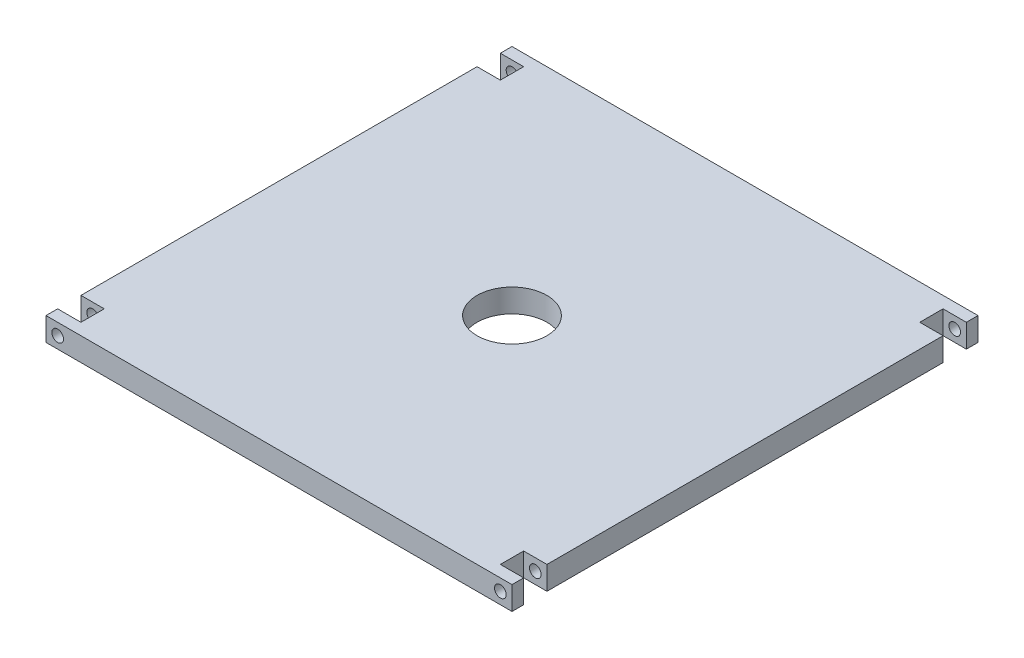
ISO-10303-21;
HEADER;
FILE_DESCRIPTION(('STEP AP214'),'2;1');
FILE_NAME('part.step','',(''),(''),'','','');
FILE_SCHEMA(('AUTOMOTIVE_DESIGN { 1 0 10303 214 1 1 1 1 }'));
ENDSEC;
DATA;
#1=APPLICATION_CONTEXT('core data for automotive mechanical design processes');
#2=APPLICATION_PROTOCOL_DEFINITION('international standard','automotive_design',2000,#1);
#3=PRODUCT_CONTEXT('',#1,'mechanical');
#4=PRODUCT('Part','Part','',(#3));
#5=PRODUCT_RELATED_PRODUCT_CATEGORY('part','',(#4));
#6=PRODUCT_DEFINITION_FORMATION('','',#4);
#7=PRODUCT_DEFINITION_CONTEXT('part definition',#1,'design');
#8=PRODUCT_DEFINITION('design','',#6,#7);
#9=PRODUCT_DEFINITION_SHAPE('','',#8);
#10=(LENGTH_UNIT() NAMED_UNIT(*) SI_UNIT(.MILLI.,.METRE.));
#11=(NAMED_UNIT(*) PLANE_ANGLE_UNIT() SI_UNIT($,.RADIAN.));
#12=(NAMED_UNIT(*) SI_UNIT($,.STERADIAN.) SOLID_ANGLE_UNIT());
#13=UNCERTAINTY_MEASURE_WITH_UNIT(LENGTH_MEASURE(1.E-05),#10,'distance_accuracy_value','');
#14=(GEOMETRIC_REPRESENTATION_CONTEXT(3) GLOBAL_UNCERTAINTY_ASSIGNED_CONTEXT((#13)) GLOBAL_UNIT_ASSIGNED_CONTEXT((#10,
#11,#12)) REPRESENTATION_CONTEXT('',''));
#15=CARTESIAN_POINT('',(0.,0.,0.));
#16=DIRECTION('',(0.,0.,1.));
#17=DIRECTION('',(1.,0.,0.));
#18=AXIS2_PLACEMENT_3D('',#15,#16,#17);
#19=CARTESIAN_POINT('',(0.,10.,0.));
#20=DIRECTION('',(0.,1.,0.));
#21=DIRECTION('',(0.,0.,1.));
#22=AXIS2_PLACEMENT_3D('',#19,#20,#21);
#23=PLANE('',#22);
#24=DIRECTION('',(1.,0.,0.));
#25=VECTOR('',#24,1.);
#26=CARTESIAN_POINT('',(-15.,10.,100.));
#27=LINE('',#26,#25);
#28=CARTESIAN_POINT('',(-100.,10.,100.));
#29=VERTEX_POINT('',#28);
#30=CARTESIAN_POINT('',(100.,10.,100.));
#31=VERTEX_POINT('',#30);
#32=EDGE_CURVE('E129',#29,#31,#27,.T.);
#33=ORIENTED_EDGE('',*,*,#32,.T.);
#34=DIRECTION('',(0.,0.,-1.));
#35=VECTOR('',#34,1.);
#36=CARTESIAN_POINT('',(100.,10.,95.));
#37=LINE('',#36,#35);
#38=CARTESIAN_POINT('',(100.,10.,95.));
#39=VERTEX_POINT('',#38);
#40=EDGE_CURVE('E351',#31,#39,#37,.T.);
#41=ORIENTED_EDGE('',*,*,#40,.T.);
#42=DIRECTION('',(-1.,0.,0.));
#43=VECTOR('',#42,1.);
#44=CARTESIAN_POINT('',(100.,10.,95.));
#45=LINE('',#44,#43);
#46=CARTESIAN_POINT('',(90.,10.,95.));
#47=VERTEX_POINT('',#46);
#48=EDGE_CURVE('E294',#39,#47,#45,.T.);
#49=ORIENTED_EDGE('',*,*,#48,.T.);
#50=DIRECTION('',(0.,0.,-1.));
#51=VECTOR('',#50,1.);
#52=CARTESIAN_POINT('',(90.,10.,95.));
#53=LINE('',#52,#51);
#54=CARTESIAN_POINT('',(90.,10.,85.));
#55=VERTEX_POINT('',#54);
#56=EDGE_CURVE('E313',#47,#55,#53,.T.);
#57=ORIENTED_EDGE('',*,*,#56,.T.);
#58=DIRECTION('',(1.,0.,0.));
#59=VECTOR('',#58,1.);
#60=CARTESIAN_POINT('',(90.,10.,85.));
#61=LINE('',#60,#59);
#62=CARTESIAN_POINT('',(100.,10.,85.));
#63=VERTEX_POINT('',#62);
#64=EDGE_CURVE('E310',#55,#63,#61,.T.);
#65=ORIENTED_EDGE('',*,*,#64,.T.);
#66=DIRECTION('',(0.,0.,-1.));
#67=VECTOR('',#66,1.);
#68=CARTESIAN_POINT('',(100.,10.,-85.));
#69=LINE('',#68,#67);
#70=CARTESIAN_POINT('',(100.,10.,-85.));
#71=VERTEX_POINT('',#70);
#72=EDGE_CURVE('E312',#63,#71,#69,.T.);
#73=ORIENTED_EDGE('',*,*,#72,.T.);
#74=DIRECTION('',(-1.,0.,0.));
#75=VECTOR('',#74,1.);
#76=CARTESIAN_POINT('',(90.,10.,-85.));
#77=LINE('',#76,#75);
#78=CARTESIAN_POINT('',(90.,10.,-85.));
#79=VERTEX_POINT('',#78);
#80=EDGE_CURVE('E315',#71,#79,#77,.T.);
#81=ORIENTED_EDGE('',*,*,#80,.T.);
#82=DIRECTION('',(0.,0.,-1.));
#83=VECTOR('',#82,1.);
#84=CARTESIAN_POINT('',(90.,10.,-95.));
#85=LINE('',#84,#83);
#86=CARTESIAN_POINT('',(90.,10.,-95.));
#87=VERTEX_POINT('',#86);
#88=EDGE_CURVE('E321',#79,#87,#85,.T.);
#89=ORIENTED_EDGE('',*,*,#88,.T.);
#90=DIRECTION('',(1.,0.,0.));
#91=VECTOR('',#90,1.);
#92=CARTESIAN_POINT('',(100.,10.,-95.));
#93=LINE('',#92,#91);
#94=CARTESIAN_POINT('',(100.,10.,-95.));
#95=VERTEX_POINT('',#94);
#96=EDGE_CURVE('E323',#87,#95,#93,.T.);
#97=ORIENTED_EDGE('',*,*,#96,.T.);
#98=DIRECTION('',(0.,0.,-1.));
#99=VECTOR('',#98,1.);
#100=CARTESIAN_POINT('',(100.,10.,-100.));
#101=LINE('',#100,#99);
#102=CARTESIAN_POINT('',(100.,10.,-100.));
#103=VERTEX_POINT('',#102);
#104=EDGE_CURVE('E325',#95,#103,#101,.T.);
#105=ORIENTED_EDGE('',*,*,#104,.T.);
#106=DIRECTION('',(-1.,0.,0.));
#107=VECTOR('',#106,1.);
#108=CARTESIAN_POINT('',(100.,10.,-100.));
#109=LINE('',#108,#107);
#110=CARTESIAN_POINT('',(-100.,10.,-100.));
#111=VERTEX_POINT('',#110);
#112=EDGE_CURVE('E327',#103,#111,#109,.T.);
#113=ORIENTED_EDGE('',*,*,#112,.T.);
#114=DIRECTION('',(0.,0.,1.));
#115=VECTOR('',#114,1.);
#116=CARTESIAN_POINT('',(-100.,10.,-100.));
#117=LINE('',#116,#115);
#118=CARTESIAN_POINT('',(-100.,10.,-95.));
#119=VERTEX_POINT('',#118);
#120=EDGE_CURVE('E329',#111,#119,#117,.T.);
#121=ORIENTED_EDGE('',*,*,#120,.T.);
#122=DIRECTION('',(1.,0.,0.));
#123=VECTOR('',#122,1.);
#124=CARTESIAN_POINT('',(-100.,10.,-95.));
#125=LINE('',#124,#123);
#126=CARTESIAN_POINT('',(-90.,10.,-95.));
#127=VERTEX_POINT('',#126);
#128=EDGE_CURVE('E331',#119,#127,#125,.T.);
#129=ORIENTED_EDGE('',*,*,#128,.T.);
#130=DIRECTION('',(0.,0.,1.));
#131=VECTOR('',#130,1.);
#132=CARTESIAN_POINT('',(-90.,10.,-95.));
#133=LINE('',#132,#131);
#134=CARTESIAN_POINT('',(-90.,10.,-85.));
#135=VERTEX_POINT('',#134);
#136=EDGE_CURVE('E333',#127,#135,#133,.T.);
#137=ORIENTED_EDGE('',*,*,#136,.T.);
#138=DIRECTION('',(-1.,0.,0.));
#139=VECTOR('',#138,1.);
#140=CARTESIAN_POINT('',(-90.,10.,-85.));
#141=LINE('',#140,#139);
#142=CARTESIAN_POINT('',(-100.,10.,-85.));
#143=VERTEX_POINT('',#142);
#144=EDGE_CURVE('E335',#135,#143,#141,.T.);
#145=ORIENTED_EDGE('',*,*,#144,.T.);
#146=DIRECTION('',(0.,0.,1.));
#147=VECTOR('',#146,1.);
#148=CARTESIAN_POINT('',(-100.,10.,-85.));
#149=LINE('',#148,#147);
#150=CARTESIAN_POINT('',(-100.,10.,85.));
#151=VERTEX_POINT('',#150);
#152=EDGE_CURVE('E337',#143,#151,#149,.T.);
#153=ORIENTED_EDGE('',*,*,#152,.T.);
#154=DIRECTION('',(1.,0.,0.));
#155=VECTOR('',#154,1.);
#156=CARTESIAN_POINT('',(-90.,10.,85.));
#157=LINE('',#156,#155);
#158=CARTESIAN_POINT('',(-90.,10.,85.));
#159=VERTEX_POINT('',#158);
#160=EDGE_CURVE('E185',#151,#159,#157,.T.);
#161=ORIENTED_EDGE('',*,*,#160,.T.);
#162=DIRECTION('',(0.,0.,1.));
#163=VECTOR('',#162,1.);
#164=CARTESIAN_POINT('',(-90.,10.,95.));
#165=LINE('',#164,#163);
#166=CARTESIAN_POINT('',(-90.,10.,95.));
#167=VERTEX_POINT('',#166);
#168=EDGE_CURVE('E179',#159,#167,#165,.T.);
#169=ORIENTED_EDGE('',*,*,#168,.T.);
#170=DIRECTION('',(-1.,0.,0.));
#171=VECTOR('',#170,1.);
#172=CARTESIAN_POINT('',(-100.,10.,95.));
#173=LINE('',#172,#171);
#174=CARTESIAN_POINT('',(-100.,10.,95.));
#175=VERTEX_POINT('',#174);
#176=EDGE_CURVE('E183',#167,#175,#173,.T.);
#177=ORIENTED_EDGE('',*,*,#176,.T.);
#178=DIRECTION('',(0.,0.,1.));
#179=VECTOR('',#178,1.);
#180=CARTESIAN_POINT('',(-100.,10.,95.));
#181=LINE('',#180,#179);
#182=EDGE_CURVE('E51',#175,#29,#181,.T.);
#183=ORIENTED_EDGE('',*,*,#182,.T.);
#184=EDGE_LOOP('',(#33,#41,#49,#57,#65,#73,#81,#89,#97,#105,#113,#121,#129,#137,#145,#153,#161,
#169,#177,#183));
#185=FACE_BOUND('',#184,.T.);
#186=CARTESIAN_POINT('',(0.,10.,0.));
#187=DIRECTION('',(0.,1.,0.));
#188=DIRECTION('',(0.,0.,1.));
#189=AXIS2_PLACEMENT_3D('',#186,#187,#188);
#190=CIRCLE('',#189,15.);
#191=CARTESIAN_POINT('',(0.,10.,15.));
#192=VERTEX_POINT('',#191);
#193=EDGE_CURVE('E205',#192,#192,#190,.T.);
#194=ORIENTED_EDGE('',*,*,#193,.F.);
#195=EDGE_LOOP('',(#194));
#196=FACE_BOUND('',#195,.T.);
#197=ADVANCED_FACE('F33',(#185,#196),#23,.T.);
#198=CARTESIAN_POINT('',(0.,0.,0.));
#199=DIRECTION('',(0.,1.,0.));
#200=DIRECTION('',(0.,0.,1.));
#201=AXIS2_PLACEMENT_3D('',#198,#199,#200);
#202=PLANE('',#201);
#203=DIRECTION('',(1.,0.,0.));
#204=VECTOR('',#203,1.);
#205=CARTESIAN_POINT('',(100.,0.,100.));
#206=LINE('',#205,#204);
#207=CARTESIAN_POINT('',(-100.,0.,100.));
#208=VERTEX_POINT('',#207);
#209=CARTESIAN_POINT('',(100.,0.,100.));
#210=VERTEX_POINT('',#209);
#211=EDGE_CURVE('E123',#208,#210,#206,.T.);
#212=ORIENTED_EDGE('',*,*,#211,.F.);
#213=DIRECTION('',(0.,0.,1.));
#214=VECTOR('',#213,1.);
#215=CARTESIAN_POINT('',(-100.,0.,95.));
#216=LINE('',#215,#214);
#217=CARTESIAN_POINT('',(-100.,0.,95.));
#218=VERTEX_POINT('',#217);
#219=EDGE_CURVE('E239',#218,#208,#216,.T.);
#220=ORIENTED_EDGE('',*,*,#219,.F.);
#221=DIRECTION('',(-1.,0.,0.));
#222=VECTOR('',#221,1.);
#223=CARTESIAN_POINT('',(-100.,0.,95.));
#224=LINE('',#223,#222);
#225=CARTESIAN_POINT('',(-90.,0.,95.));
#226=VERTEX_POINT('',#225);
#227=EDGE_CURVE('E116',#226,#218,#224,.T.);
#228=ORIENTED_EDGE('',*,*,#227,.F.);
#229=DIRECTION('',(0.,0.,1.));
#230=VECTOR('',#229,1.);
#231=CARTESIAN_POINT('',(-90.,0.,95.));
#232=LINE('',#231,#230);
#233=CARTESIAN_POINT('',(-90.,0.,85.));
#234=VERTEX_POINT('',#233);
#235=EDGE_CURVE('E193',#234,#226,#232,.T.);
#236=ORIENTED_EDGE('',*,*,#235,.F.);
#237=DIRECTION('',(1.,0.,0.));
#238=VECTOR('',#237,1.);
#239=CARTESIAN_POINT('',(-90.,0.,85.));
#240=LINE('',#239,#238);
#241=CARTESIAN_POINT('',(-100.,0.,85.));
#242=VERTEX_POINT('',#241);
#243=EDGE_CURVE('E235',#242,#234,#240,.T.);
#244=ORIENTED_EDGE('',*,*,#243,.F.);
#245=DIRECTION('',(0.,0.,1.));
#246=VECTOR('',#245,1.);
#247=CARTESIAN_POINT('',(-100.,0.,-85.));
#248=LINE('',#247,#246);
#249=CARTESIAN_POINT('',(-100.,0.,-85.));
#250=VERTEX_POINT('',#249);
#251=EDGE_CURVE('E233',#250,#242,#248,.T.);
#252=ORIENTED_EDGE('',*,*,#251,.F.);
#253=DIRECTION('',(-1.,0.,0.));
#254=VECTOR('',#253,1.);
#255=CARTESIAN_POINT('',(-90.,0.,-85.));
#256=LINE('',#255,#254);
#257=CARTESIAN_POINT('',(-90.,0.,-85.));
#258=VERTEX_POINT('',#257);
#259=EDGE_CURVE('E231',#258,#250,#256,.T.);
#260=ORIENTED_EDGE('',*,*,#259,.F.);
#261=DIRECTION('',(0.,0.,1.));
#262=VECTOR('',#261,1.);
#263=CARTESIAN_POINT('',(-90.,0.,-95.));
#264=LINE('',#263,#262);
#265=CARTESIAN_POINT('',(-90.,0.,-95.));
#266=VERTEX_POINT('',#265);
#267=EDGE_CURVE('E229',#266,#258,#264,.T.);
#268=ORIENTED_EDGE('',*,*,#267,.F.);
#269=DIRECTION('',(1.,0.,0.));
#270=VECTOR('',#269,1.);
#271=CARTESIAN_POINT('',(-100.,0.,-95.));
#272=LINE('',#271,#270);
#273=CARTESIAN_POINT('',(-100.,0.,-95.));
#274=VERTEX_POINT('',#273);
#275=EDGE_CURVE('E227',#274,#266,#272,.T.);
#276=ORIENTED_EDGE('',*,*,#275,.F.);
#277=DIRECTION('',(0.,0.,1.));
#278=VECTOR('',#277,1.);
#279=CARTESIAN_POINT('',(-100.,0.,-100.));
#280=LINE('',#279,#278);
#281=CARTESIAN_POINT('',(-100.,0.,-100.));
#282=VERTEX_POINT('',#281);
#283=EDGE_CURVE('E225',#282,#274,#280,.T.);
#284=ORIENTED_EDGE('',*,*,#283,.F.);
#285=DIRECTION('',(-1.,0.,0.));
#286=VECTOR('',#285,1.);
#287=CARTESIAN_POINT('',(100.,0.,-100.));
#288=LINE('',#287,#286);
#289=CARTESIAN_POINT('',(100.,0.,-100.));
#290=VERTEX_POINT('',#289);
#291=EDGE_CURVE('E223',#290,#282,#288,.T.);
#292=ORIENTED_EDGE('',*,*,#291,.F.);
#293=DIRECTION('',(0.,0.,-1.));
#294=VECTOR('',#293,1.);
#295=CARTESIAN_POINT('',(100.,0.,-100.));
#296=LINE('',#295,#294);
#297=CARTESIAN_POINT('',(100.,0.,-95.));
#298=VERTEX_POINT('',#297);
#299=EDGE_CURVE('E221',#298,#290,#296,.T.);
#300=ORIENTED_EDGE('',*,*,#299,.F.);
#301=DIRECTION('',(1.,0.,0.));
#302=VECTOR('',#301,1.);
#303=CARTESIAN_POINT('',(100.,0.,-95.));
#304=LINE('',#303,#302);
#305=CARTESIAN_POINT('',(90.,0.,-95.));
#306=VERTEX_POINT('',#305);
#307=EDGE_CURVE('E219',#306,#298,#304,.T.);
#308=ORIENTED_EDGE('',*,*,#307,.F.);
#309=DIRECTION('',(0.,0.,-1.));
#310=VECTOR('',#309,1.);
#311=CARTESIAN_POINT('',(90.,0.,-95.));
#312=LINE('',#311,#310);
#313=CARTESIAN_POINT('',(90.,0.,-85.));
#314=VERTEX_POINT('',#313);
#315=EDGE_CURVE('E217',#314,#306,#312,.T.);
#316=ORIENTED_EDGE('',*,*,#315,.F.);
#317=DIRECTION('',(-1.,0.,0.));
#318=VECTOR('',#317,1.);
#319=CARTESIAN_POINT('',(90.,0.,-85.));
#320=LINE('',#319,#318);
#321=CARTESIAN_POINT('',(100.,0.,-85.));
#322=VERTEX_POINT('',#321);
#323=EDGE_CURVE('E215',#322,#314,#320,.T.);
#324=ORIENTED_EDGE('',*,*,#323,.F.);
#325=DIRECTION('',(0.,0.,-1.));
#326=VECTOR('',#325,1.);
#327=CARTESIAN_POINT('',(100.,0.,-85.));
#328=LINE('',#327,#326);
#329=CARTESIAN_POINT('',(100.,0.,85.));
#330=VERTEX_POINT('',#329);
#331=EDGE_CURVE('E213',#330,#322,#328,.T.);
#332=ORIENTED_EDGE('',*,*,#331,.F.);
#333=DIRECTION('',(1.,0.,0.));
#334=VECTOR('',#333,1.);
#335=CARTESIAN_POINT('',(90.,0.,85.));
#336=LINE('',#335,#334);
#337=CARTESIAN_POINT('',(90.,0.,85.));
#338=VERTEX_POINT('',#337);
#339=EDGE_CURVE('E211',#338,#330,#336,.T.);
#340=ORIENTED_EDGE('',*,*,#339,.F.);
#341=DIRECTION('',(0.,0.,-1.));
#342=VECTOR('',#341,1.);
#343=CARTESIAN_POINT('',(90.,0.,95.));
#344=LINE('',#343,#342);
#345=CARTESIAN_POINT('',(90.,0.,95.));
#346=VERTEX_POINT('',#345);
#347=EDGE_CURVE('E209',#346,#338,#344,.T.);
#348=ORIENTED_EDGE('',*,*,#347,.F.);
#349=DIRECTION('',(-1.,0.,0.));
#350=VECTOR('',#349,1.);
#351=CARTESIAN_POINT('',(100.,0.,95.));
#352=LINE('',#351,#350);
#353=CARTESIAN_POINT('',(100.,0.,95.));
#354=VERTEX_POINT('',#353);
#355=EDGE_CURVE('E207',#354,#346,#352,.T.);
#356=ORIENTED_EDGE('',*,*,#355,.F.);
#357=DIRECTION('',(0.,0.,-1.));
#358=VECTOR('',#357,1.);
#359=CARTESIAN_POINT('',(100.,0.,95.));
#360=LINE('',#359,#358);
#361=EDGE_CURVE('E204',#210,#354,#360,.T.);
#362=ORIENTED_EDGE('',*,*,#361,.F.);
#363=EDGE_LOOP('',(#212,#220,#228,#236,#244,#252,#260,#268,#276,#284,#292,#300,#308,#316,#324,
#332,#340,#348,#356,#362));
#364=FACE_BOUND('',#363,.T.);
#365=CARTESIAN_POINT('',(0.,0.,0.));
#366=DIRECTION('',(0.,1.,0.));
#367=DIRECTION('',(0.,0.,1.));
#368=AXIS2_PLACEMENT_3D('',#365,#366,#367);
#369=CIRCLE('',#368,15.);
#370=CARTESIAN_POINT('',(0.,0.,15.));
#371=VERTEX_POINT('',#370);
#372=EDGE_CURVE('E355',#371,#371,#369,.T.);
#373=ORIENTED_EDGE('',*,*,#372,.T.);
#374=EDGE_LOOP('',(#373));
#375=FACE_BOUND('',#374,.T.);
#376=ADVANCED_FACE('F298',(#364,#375),#202,.F.);
#377=CARTESIAN_POINT('',(100.,10.,100.));
#378=DIRECTION('',(0.,0.,-1.));
#379=DIRECTION('',(-1.,0.,0.));
#380=AXIS2_PLACEMENT_3D('',#377,#378,#379);
#381=PLANE('',#380);
#382=CARTESIAN_POINT('',(95.,5.,100.));
#383=DIRECTION('',(0.,0.,1.));
#384=DIRECTION('',(-1.,0.,0.));
#385=AXIS2_PLACEMENT_3D('',#382,#383,#384);
#386=CIRCLE('',#385,2.5);
#387=CARTESIAN_POINT('',(92.5,5.,100.));
#388=VERTEX_POINT('',#387);
#389=EDGE_CURVE('E632',#388,#388,#386,.T.);
#390=ORIENTED_EDGE('',*,*,#389,.F.);
#391=EDGE_LOOP('',(#390));
#392=FACE_BOUND('',#391,.T.);
#393=CARTESIAN_POINT('',(-95.,5.,100.));
#394=DIRECTION('',(0.,0.,1.));
#395=DIRECTION('',(1.,0.,0.));
#396=AXIS2_PLACEMENT_3D('',#393,#394,#395);
#397=CIRCLE('',#396,2.5);
#398=CARTESIAN_POINT('',(-92.5,5.,100.));
#399=VERTEX_POINT('',#398);
#400=EDGE_CURVE('E636',#399,#399,#397,.T.);
#401=ORIENTED_EDGE('',*,*,#400,.F.);
#402=EDGE_LOOP('',(#401));
#403=FACE_BOUND('',#402,.T.);
#404=ORIENTED_EDGE('',*,*,#211,.T.);
#405=DIRECTION('',(0.,-1.,0.));
#406=VECTOR('',#405,1.);
#407=CARTESIAN_POINT('',(100.,10.,100.));
#408=LINE('',#407,#406);
#409=EDGE_CURVE('E11',#31,#210,#408,.T.);
#410=ORIENTED_EDGE('',*,*,#409,.F.);
#411=ORIENTED_EDGE('',*,*,#32,.F.);
#412=DIRECTION('',(0.,-1.,0.));
#413=VECTOR('',#412,1.);
#414=CARTESIAN_POINT('',(-100.,10.,100.));
#415=LINE('',#414,#413);
#416=EDGE_CURVE('E199',#29,#208,#415,.T.);
#417=ORIENTED_EDGE('',*,*,#416,.T.);
#418=EDGE_LOOP('',(#404,#410,#411,#417));
#419=FACE_BOUND('',#418,.T.);
#420=ADVANCED_FACE('F35',(#392,#403,#419),#381,.F.);
#421=CARTESIAN_POINT('',(100.,10.,95.));
#422=DIRECTION('',(-1.,0.,0.));
#423=DIRECTION('',(0.,0.,1.));
#424=AXIS2_PLACEMENT_3D('',#421,#422,#423);
#425=PLANE('',#424);
#426=ORIENTED_EDGE('',*,*,#361,.T.);
#427=DIRECTION('',(0.,-1.,0.));
#428=VECTOR('',#427,1.);
#429=CARTESIAN_POINT('',(100.,10.,95.));
#430=LINE('',#429,#428);
#431=EDGE_CURVE('E43',#39,#354,#430,.T.);
#432=ORIENTED_EDGE('',*,*,#431,.F.);
#433=ORIENTED_EDGE('',*,*,#40,.F.);
#434=ORIENTED_EDGE('',*,*,#409,.T.);
#435=EDGE_LOOP('',(#426,#432,#433,#434));
#436=FACE_BOUND('',#435,.T.);
#437=ADVANCED_FACE('F357',(#436),#425,.F.);
#438=CARTESIAN_POINT('',(100.,10.,95.));
#439=DIRECTION('',(0.,0.,1.));
#440=DIRECTION('',(1.,0.,0.));
#441=AXIS2_PLACEMENT_3D('',#438,#439,#440);
#442=PLANE('',#441);
#443=CARTESIAN_POINT('',(95.,5.,95.));
#444=DIRECTION('',(0.,0.,1.));
#445=DIRECTION('',(1.,0.,0.));
#446=AXIS2_PLACEMENT_3D('',#443,#444,#445);
#447=CIRCLE('',#446,2.5);
#448=CARTESIAN_POINT('',(97.5,5.,95.));
#449=VERTEX_POINT('',#448);
#450=EDGE_CURVE('E635',#449,#449,#447,.T.);
#451=ORIENTED_EDGE('',*,*,#450,.T.);
#452=EDGE_LOOP('',(#451));
#453=FACE_BOUND('',#452,.T.);
#454=ORIENTED_EDGE('',*,*,#355,.T.);
#455=DIRECTION('',(0.,-1.,0.));
#456=VECTOR('',#455,1.);
#457=CARTESIAN_POINT('',(90.,10.,95.));
#458=LINE('',#457,#456);
#459=EDGE_CURVE('E284',#47,#346,#458,.T.);
#460=ORIENTED_EDGE('',*,*,#459,.F.);
#461=ORIENTED_EDGE('',*,*,#48,.F.);
#462=ORIENTED_EDGE('',*,*,#431,.T.);
#463=EDGE_LOOP('',(#454,#460,#461,#462));
#464=FACE_BOUND('',#463,.T.);
#465=ADVANCED_FACE('F292',(#453,#464),#442,.F.);
#466=CARTESIAN_POINT('',(90.,10.,95.));
#467=DIRECTION('',(-1.,0.,0.));
#468=DIRECTION('',(0.,0.,1.));
#469=AXIS2_PLACEMENT_3D('',#466,#467,#468);
#470=PLANE('',#469);
#471=ORIENTED_EDGE('',*,*,#347,.T.);
#472=DIRECTION('',(0.,-1.,0.));
#473=VECTOR('',#472,1.);
#474=CARTESIAN_POINT('',(90.,10.,85.));
#475=LINE('',#474,#473);
#476=EDGE_CURVE('E281',#55,#338,#475,.T.);
#477=ORIENTED_EDGE('',*,*,#476,.F.);
#478=ORIENTED_EDGE('',*,*,#56,.F.);
#479=ORIENTED_EDGE('',*,*,#459,.T.);
#480=EDGE_LOOP('',(#471,#477,#478,#479));
#481=FACE_BOUND('',#480,.T.);
#482=ADVANCED_FACE('F304',(#481),#470,.F.);
#483=CARTESIAN_POINT('',(90.,10.,85.));
#484=DIRECTION('',(0.,0.,-1.));
#485=DIRECTION('',(-1.,0.,0.));
#486=AXIS2_PLACEMENT_3D('',#483,#484,#485);
#487=PLANE('',#486);
#488=CARTESIAN_POINT('',(95.,5.,85.));
#489=DIRECTION('',(0.,0.,-1.));
#490=DIRECTION('',(-1.,0.,0.));
#491=AXIS2_PLACEMENT_3D('',#488,#489,#490);
#492=CIRCLE('',#491,2.5);
#493=CARTESIAN_POINT('',(92.5,5.,85.));
#494=VERTEX_POINT('',#493);
#495=EDGE_CURVE('E637',#494,#494,#492,.T.);
#496=ORIENTED_EDGE('',*,*,#495,.T.);
#497=EDGE_LOOP('',(#496));
#498=FACE_BOUND('',#497,.T.);
#499=ORIENTED_EDGE('',*,*,#339,.T.);
#500=DIRECTION('',(0.,-1.,0.));
#501=VECTOR('',#500,1.);
#502=CARTESIAN_POINT('',(100.,10.,85.));
#503=LINE('',#502,#501);
#504=EDGE_CURVE('E278',#63,#330,#503,.T.);
#505=ORIENTED_EDGE('',*,*,#504,.F.);
#506=ORIENTED_EDGE('',*,*,#64,.F.);
#507=ORIENTED_EDGE('',*,*,#476,.T.);
#508=EDGE_LOOP('',(#499,#505,#506,#507));
#509=FACE_BOUND('',#508,.T.);
#510=ADVANCED_FACE('F308',(#498,#509),#487,.F.);
#511=CARTESIAN_POINT('',(100.,10.,-85.));
#512=DIRECTION('',(-1.,0.,0.));
#513=DIRECTION('',(0.,0.,1.));
#514=AXIS2_PLACEMENT_3D('',#511,#512,#513);
#515=PLANE('',#514);
#516=ORIENTED_EDGE('',*,*,#331,.T.);
#517=DIRECTION('',(0.,-1.,0.));
#518=VECTOR('',#517,1.);
#519=CARTESIAN_POINT('',(100.,10.,-85.));
#520=LINE('',#519,#518);
#521=EDGE_CURVE('E275',#71,#322,#520,.T.);
#522=ORIENTED_EDGE('',*,*,#521,.F.);
#523=ORIENTED_EDGE('',*,*,#72,.F.);
#524=ORIENTED_EDGE('',*,*,#504,.T.);
#525=EDGE_LOOP('',(#516,#522,#523,#524));
#526=FACE_BOUND('',#525,.T.);
#527=ADVANCED_FACE('F423',(#526),#515,.F.);
#528=CARTESIAN_POINT('',(90.,10.,-85.));
#529=DIRECTION('',(0.,0.,1.));
#530=DIRECTION('',(1.,0.,0.));
#531=AXIS2_PLACEMENT_3D('',#528,#529,#530);
#532=PLANE('',#531);
#533=CARTESIAN_POINT('',(95.,5.,-85.));
#534=DIRECTION('',(0.,0.,1.));
#535=DIRECTION('',(1.,0.,0.));
#536=AXIS2_PLACEMENT_3D('',#533,#534,#535);
#537=CIRCLE('',#536,2.5);
#538=CARTESIAN_POINT('',(97.5,5.,-85.));
#539=VERTEX_POINT('',#538);
#540=EDGE_CURVE('E643',#539,#539,#537,.T.);
#541=ORIENTED_EDGE('',*,*,#540,.T.);
#542=EDGE_LOOP('',(#541));
#543=FACE_BOUND('',#542,.T.);
#544=ORIENTED_EDGE('',*,*,#323,.T.);
#545=DIRECTION('',(0.,-1.,0.));
#546=VECTOR('',#545,1.);
#547=CARTESIAN_POINT('',(90.,10.,-85.));
#548=LINE('',#547,#546);
#549=EDGE_CURVE('E272',#79,#314,#548,.T.);
#550=ORIENTED_EDGE('',*,*,#549,.F.);
#551=ORIENTED_EDGE('',*,*,#80,.F.);
#552=ORIENTED_EDGE('',*,*,#521,.T.);
#553=EDGE_LOOP('',(#544,#550,#551,#552));
#554=FACE_BOUND('',#553,.T.);
#555=ADVANCED_FACE('F419',(#543,#554),#532,.F.);
#556=CARTESIAN_POINT('',(90.,10.,-95.));
#557=DIRECTION('',(-1.,0.,0.));
#558=DIRECTION('',(0.,0.,1.));
#559=AXIS2_PLACEMENT_3D('',#556,#557,#558);
#560=PLANE('',#559);
#561=ORIENTED_EDGE('',*,*,#315,.T.);
#562=DIRECTION('',(0.,-1.,0.));
#563=VECTOR('',#562,1.);
#564=CARTESIAN_POINT('',(90.,10.,-95.));
#565=LINE('',#564,#563);
#566=EDGE_CURVE('E269',#87,#306,#565,.T.);
#567=ORIENTED_EDGE('',*,*,#566,.F.);
#568=ORIENTED_EDGE('',*,*,#88,.F.);
#569=ORIENTED_EDGE('',*,*,#549,.T.);
#570=EDGE_LOOP('',(#561,#567,#568,#569));
#571=FACE_BOUND('',#570,.T.);
#572=ADVANCED_FACE('F415',(#571),#560,.F.);
#573=CARTESIAN_POINT('',(100.,10.,-95.));
#574=DIRECTION('',(0.,0.,-1.));
#575=DIRECTION('',(-1.,0.,0.));
#576=AXIS2_PLACEMENT_3D('',#573,#574,#575);
#577=PLANE('',#576);
#578=CARTESIAN_POINT('',(95.,5.,-95.));
#579=DIRECTION('',(0.,0.,-1.));
#580=DIRECTION('',(-1.,0.,0.));
#581=AXIS2_PLACEMENT_3D('',#578,#579,#580);
#582=CIRCLE('',#581,2.5);
#583=CARTESIAN_POINT('',(92.5,5.,-95.));
#584=VERTEX_POINT('',#583);
#585=EDGE_CURVE('E705',#584,#584,#582,.T.);
#586=ORIENTED_EDGE('',*,*,#585,.T.);
#587=EDGE_LOOP('',(#586));
#588=FACE_BOUND('',#587,.T.);
#589=ORIENTED_EDGE('',*,*,#307,.T.);
#590=DIRECTION('',(0.,-1.,0.));
#591=VECTOR('',#590,1.);
#592=CARTESIAN_POINT('',(100.,10.,-95.));
#593=LINE('',#592,#591);
#594=EDGE_CURVE('E266',#95,#298,#593,.T.);
#595=ORIENTED_EDGE('',*,*,#594,.F.);
#596=ORIENTED_EDGE('',*,*,#96,.F.);
#597=ORIENTED_EDGE('',*,*,#566,.T.);
#598=EDGE_LOOP('',(#589,#595,#596,#597));
#599=FACE_BOUND('',#598,.T.);
#600=ADVANCED_FACE('F411',(#588,#599),#577,.F.);
#601=CARTESIAN_POINT('',(100.,10.,-100.));
#602=DIRECTION('',(-1.,0.,0.));
#603=DIRECTION('',(0.,0.,1.));
#604=AXIS2_PLACEMENT_3D('',#601,#602,#603);
#605=PLANE('',#604);
#606=ORIENTED_EDGE('',*,*,#299,.T.);
#607=DIRECTION('',(0.,-1.,0.));
#608=VECTOR('',#607,1.);
#609=CARTESIAN_POINT('',(100.,10.,-100.));
#610=LINE('',#609,#608);
#611=EDGE_CURVE('E263',#103,#290,#610,.T.);
#612=ORIENTED_EDGE('',*,*,#611,.F.);
#613=ORIENTED_EDGE('',*,*,#104,.F.);
#614=ORIENTED_EDGE('',*,*,#594,.T.);
#615=EDGE_LOOP('',(#606,#612,#613,#614));
#616=FACE_BOUND('',#615,.T.);
#617=ADVANCED_FACE('F407',(#616),#605,.F.);
#618=CARTESIAN_POINT('',(100.,10.,-100.));
#619=DIRECTION('',(0.,0.,1.));
#620=DIRECTION('',(1.,0.,0.));
#621=AXIS2_PLACEMENT_3D('',#618,#619,#620);
#622=PLANE('',#621);
#623=CARTESIAN_POINT('',(95.,5.,-100.));
#624=DIRECTION('',(0.,0.,1.));
#625=DIRECTION('',(-1.,0.,0.));
#626=AXIS2_PLACEMENT_3D('',#623,#624,#625);
#627=CIRCLE('',#626,2.5);
#628=CARTESIAN_POINT('',(92.5,5.,-100.));
#629=VERTEX_POINT('',#628);
#630=EDGE_CURVE('E708',#629,#629,#627,.T.);
#631=ORIENTED_EDGE('',*,*,#630,.T.);
#632=EDGE_LOOP('',(#631));
#633=FACE_BOUND('',#632,.T.);
#634=CARTESIAN_POINT('',(-95.,5.,-100.));
#635=DIRECTION('',(0.,0.,1.));
#636=DIRECTION('',(1.,0.,0.));
#637=AXIS2_PLACEMENT_3D('',#634,#635,#636);
#638=CIRCLE('',#637,2.5);
#639=CARTESIAN_POINT('',(-92.5,5.,-100.));
#640=VERTEX_POINT('',#639);
#641=EDGE_CURVE('E640',#640,#640,#638,.T.);
#642=ORIENTED_EDGE('',*,*,#641,.T.);
#643=EDGE_LOOP('',(#642));
#644=FACE_BOUND('',#643,.T.);
#645=ORIENTED_EDGE('',*,*,#291,.T.);
#646=DIRECTION('',(0.,-1.,0.));
#647=VECTOR('',#646,1.);
#648=CARTESIAN_POINT('',(-100.,10.,-100.));
#649=LINE('',#648,#647);
#650=EDGE_CURVE('E260',#111,#282,#649,.T.);
#651=ORIENTED_EDGE('',*,*,#650,.F.);
#652=ORIENTED_EDGE('',*,*,#112,.F.);
#653=ORIENTED_EDGE('',*,*,#611,.T.);
#654=EDGE_LOOP('',(#645,#651,#652,#653));
#655=FACE_BOUND('',#654,.T.);
#656=ADVANCED_FACE('F403',(#633,#644,#655),#622,.F.);
#657=CARTESIAN_POINT('',(-100.,10.,-100.));
#658=DIRECTION('',(1.,0.,0.));
#659=DIRECTION('',(0.,0.,-1.));
#660=AXIS2_PLACEMENT_3D('',#657,#658,#659);
#661=PLANE('',#660);
#662=ORIENTED_EDGE('',*,*,#283,.T.);
#663=DIRECTION('',(0.,-1.,0.));
#664=VECTOR('',#663,1.);
#665=CARTESIAN_POINT('',(-100.,10.,-95.));
#666=LINE('',#665,#664);
#667=EDGE_CURVE('E257',#119,#274,#666,.T.);
#668=ORIENTED_EDGE('',*,*,#667,.F.);
#669=ORIENTED_EDGE('',*,*,#120,.F.);
#670=ORIENTED_EDGE('',*,*,#650,.T.);
#671=EDGE_LOOP('',(#662,#668,#669,#670));
#672=FACE_BOUND('',#671,.T.);
#673=ADVANCED_FACE('F399',(#672),#661,.F.);
#674=CARTESIAN_POINT('',(-100.,10.,-95.));
#675=DIRECTION('',(0.,0.,-1.));
#676=DIRECTION('',(-1.,0.,0.));
#677=AXIS2_PLACEMENT_3D('',#674,#675,#676);
#678=PLANE('',#677);
#679=CARTESIAN_POINT('',(-95.,5.,-95.));
#680=DIRECTION('',(0.,0.,-1.));
#681=DIRECTION('',(-1.,0.,0.));
#682=AXIS2_PLACEMENT_3D('',#679,#680,#681);
#683=CIRCLE('',#682,2.5);
#684=CARTESIAN_POINT('',(-97.5,5.,-95.));
#685=VERTEX_POINT('',#684);
#686=EDGE_CURVE('E655',#685,#685,#683,.T.);
#687=ORIENTED_EDGE('',*,*,#686,.T.);
#688=EDGE_LOOP('',(#687));
#689=FACE_BOUND('',#688,.T.);
#690=ORIENTED_EDGE('',*,*,#275,.T.);
#691=DIRECTION('',(0.,-1.,0.));
#692=VECTOR('',#691,1.);
#693=CARTESIAN_POINT('',(-90.,10.,-95.));
#694=LINE('',#693,#692);
#695=EDGE_CURVE('E254',#127,#266,#694,.T.);
#696=ORIENTED_EDGE('',*,*,#695,.F.);
#697=ORIENTED_EDGE('',*,*,#128,.F.);
#698=ORIENTED_EDGE('',*,*,#667,.T.);
#699=EDGE_LOOP('',(#690,#696,#697,#698));
#700=FACE_BOUND('',#699,.T.);
#701=ADVANCED_FACE('F395',(#689,#700),#678,.F.);
#702=CARTESIAN_POINT('',(-90.,10.,-95.));
#703=DIRECTION('',(1.,0.,0.));
#704=DIRECTION('',(0.,0.,-1.));
#705=AXIS2_PLACEMENT_3D('',#702,#703,#704);
#706=PLANE('',#705);
#707=ORIENTED_EDGE('',*,*,#267,.T.);
#708=DIRECTION('',(0.,-1.,0.));
#709=VECTOR('',#708,1.);
#710=CARTESIAN_POINT('',(-90.,10.,-85.));
#711=LINE('',#710,#709);
#712=EDGE_CURVE('E251',#135,#258,#711,.T.);
#713=ORIENTED_EDGE('',*,*,#712,.F.);
#714=ORIENTED_EDGE('',*,*,#136,.F.);
#715=ORIENTED_EDGE('',*,*,#695,.T.);
#716=EDGE_LOOP('',(#707,#713,#714,#715));
#717=FACE_BOUND('',#716,.T.);
#718=ADVANCED_FACE('F391',(#717),#706,.F.);
#719=CARTESIAN_POINT('',(-90.,10.,-85.));
#720=DIRECTION('',(0.,0.,1.));
#721=DIRECTION('',(1.,0.,0.));
#722=AXIS2_PLACEMENT_3D('',#719,#720,#721);
#723=PLANE('',#722);
#724=CARTESIAN_POINT('',(-95.,5.,-85.));
#725=DIRECTION('',(0.,0.,1.));
#726=DIRECTION('',(1.,0.,0.));
#727=AXIS2_PLACEMENT_3D('',#724,#725,#726);
#728=CIRCLE('',#727,2.5);
#729=CARTESIAN_POINT('',(-92.5,5.,-85.));
#730=VERTEX_POINT('',#729);
#731=EDGE_CURVE('E652',#730,#730,#728,.T.);
#732=ORIENTED_EDGE('',*,*,#731,.T.);
#733=EDGE_LOOP('',(#732));
#734=FACE_BOUND('',#733,.T.);
#735=ORIENTED_EDGE('',*,*,#259,.T.);
#736=DIRECTION('',(0.,-1.,0.));
#737=VECTOR('',#736,1.);
#738=CARTESIAN_POINT('',(-100.,10.,-85.));
#739=LINE('',#738,#737);
#740=EDGE_CURVE('E248',#143,#250,#739,.T.);
#741=ORIENTED_EDGE('',*,*,#740,.F.);
#742=ORIENTED_EDGE('',*,*,#144,.F.);
#743=ORIENTED_EDGE('',*,*,#712,.T.);
#744=EDGE_LOOP('',(#735,#741,#742,#743));
#745=FACE_BOUND('',#744,.T.);
#746=ADVANCED_FACE('F388',(#734,#745),#723,.F.);
#747=CARTESIAN_POINT('',(-100.,10.,-85.));
#748=DIRECTION('',(1.,0.,0.));
#749=DIRECTION('',(0.,0.,-1.));
#750=AXIS2_PLACEMENT_3D('',#747,#748,#749);
#751=PLANE('',#750);
#752=ORIENTED_EDGE('',*,*,#251,.T.);
#753=DIRECTION('',(0.,-1.,0.));
#754=VECTOR('',#753,1.);
#755=CARTESIAN_POINT('',(-100.,10.,85.));
#756=LINE('',#755,#754);
#757=EDGE_CURVE('E245',#151,#242,#756,.T.);
#758=ORIENTED_EDGE('',*,*,#757,.F.);
#759=ORIENTED_EDGE('',*,*,#152,.F.);
#760=ORIENTED_EDGE('',*,*,#740,.T.);
#761=EDGE_LOOP('',(#752,#758,#759,#760));
#762=FACE_BOUND('',#761,.T.);
#763=ADVANCED_FACE('F343',(#762),#751,.F.);
#764=CARTESIAN_POINT('',(-90.,10.,85.));
#765=DIRECTION('',(0.,0.,-1.));
#766=DIRECTION('',(-1.,0.,0.));
#767=AXIS2_PLACEMENT_3D('',#764,#765,#766);
#768=PLANE('',#767);
#769=CARTESIAN_POINT('',(-95.,5.,85.));
#770=DIRECTION('',(0.,0.,-1.));
#771=DIRECTION('',(-1.,0.,0.));
#772=AXIS2_PLACEMENT_3D('',#769,#770,#771);
#773=CIRCLE('',#772,2.5);
#774=CARTESIAN_POINT('',(-97.5,5.,85.));
#775=VERTEX_POINT('',#774);
#776=EDGE_CURVE('E649',#775,#775,#773,.T.);
#777=ORIENTED_EDGE('',*,*,#776,.T.);
#778=EDGE_LOOP('',(#777));
#779=FACE_BOUND('',#778,.T.);
#780=ORIENTED_EDGE('',*,*,#243,.T.);
#781=DIRECTION('',(0.,-1.,0.));
#782=VECTOR('',#781,1.);
#783=CARTESIAN_POINT('',(-90.,10.,85.));
#784=LINE('',#783,#782);
#785=EDGE_CURVE('E194',#159,#234,#784,.T.);
#786=ORIENTED_EDGE('',*,*,#785,.F.);
#787=ORIENTED_EDGE('',*,*,#160,.F.);
#788=ORIENTED_EDGE('',*,*,#757,.T.);
#789=EDGE_LOOP('',(#780,#786,#787,#788));
#790=FACE_BOUND('',#789,.T.);
#791=ADVANCED_FACE('F347',(#779,#790),#768,.F.);
#792=CARTESIAN_POINT('',(-90.,10.,95.));
#793=DIRECTION('',(1.,0.,0.));
#794=DIRECTION('',(0.,0.,-1.));
#795=AXIS2_PLACEMENT_3D('',#792,#793,#794);
#796=PLANE('',#795);
#797=ORIENTED_EDGE('',*,*,#235,.T.);
#798=DIRECTION('',(0.,-1.,0.));
#799=VECTOR('',#798,1.);
#800=CARTESIAN_POINT('',(-90.,10.,95.));
#801=LINE('',#800,#799);
#802=EDGE_CURVE('E190',#167,#226,#801,.T.);
#803=ORIENTED_EDGE('',*,*,#802,.F.);
#804=ORIENTED_EDGE('',*,*,#168,.F.);
#805=ORIENTED_EDGE('',*,*,#785,.T.);
#806=EDGE_LOOP('',(#797,#803,#804,#805));
#807=FACE_BOUND('',#806,.T.);
#808=ADVANCED_FACE('F191',(#807),#796,.F.);
#809=CARTESIAN_POINT('',(-100.,10.,95.));
#810=DIRECTION('',(0.,0.,1.));
#811=DIRECTION('',(1.,0.,0.));
#812=AXIS2_PLACEMENT_3D('',#809,#810,#811);
#813=PLANE('',#812);
#814=CARTESIAN_POINT('',(-95.,5.,95.));
#815=DIRECTION('',(0.,0.,1.));
#816=DIRECTION('',(1.,0.,0.));
#817=AXIS2_PLACEMENT_3D('',#814,#815,#816);
#818=CIRCLE('',#817,2.5);
#819=CARTESIAN_POINT('',(-92.5,5.,95.));
#820=VERTEX_POINT('',#819);
#821=EDGE_CURVE('E37',#820,#820,#818,.T.);
#822=ORIENTED_EDGE('',*,*,#821,.T.);
#823=EDGE_LOOP('',(#822));
#824=FACE_BOUND('',#823,.T.);
#825=ORIENTED_EDGE('',*,*,#227,.T.);
#826=DIRECTION('',(0.,-1.,0.));
#827=VECTOR('',#826,1.);
#828=CARTESIAN_POINT('',(-100.,10.,95.));
#829=LINE('',#828,#827);
#830=EDGE_CURVE('E195',#175,#218,#829,.T.);
#831=ORIENTED_EDGE('',*,*,#830,.F.);
#832=ORIENTED_EDGE('',*,*,#176,.F.);
#833=ORIENTED_EDGE('',*,*,#802,.T.);
#834=EDGE_LOOP('',(#825,#831,#832,#833));
#835=FACE_BOUND('',#834,.T.);
#836=ADVANCED_FACE('F197',(#824,#835),#813,.F.);
#837=CARTESIAN_POINT('',(-100.,10.,95.));
#838=DIRECTION('',(1.,0.,0.));
#839=DIRECTION('',(0.,0.,-1.));
#840=AXIS2_PLACEMENT_3D('',#837,#838,#839);
#841=PLANE('',#840);
#842=ORIENTED_EDGE('',*,*,#219,.T.);
#843=ORIENTED_EDGE('',*,*,#416,.F.);
#844=ORIENTED_EDGE('',*,*,#182,.F.);
#845=ORIENTED_EDGE('',*,*,#830,.T.);
#846=EDGE_LOOP('',(#842,#843,#844,#845));
#847=FACE_BOUND('',#846,.T.);
#848=ADVANCED_FACE('F349',(#847),#841,.F.);
#849=CARTESIAN_POINT('',(0.,10.,0.));
#850=DIRECTION('',(0.,-1.,0.));
#851=DIRECTION('',(0.,0.,-1.));
#852=AXIS2_PLACEMENT_3D('',#849,#850,#851);
#853=CYLINDRICAL_SURFACE('',#852,15.);
#854=ORIENTED_EDGE('',*,*,#193,.T.);
#855=EDGE_LOOP('',(#854));
#856=FACE_BOUND('',#855,.T.);
#857=ORIENTED_EDGE('',*,*,#372,.F.);
#858=EDGE_LOOP('',(#857));
#859=FACE_BOUND('',#858,.T.);
#860=ADVANCED_FACE('F373',(#856,#859),#853,.F.);
#861=CARTESIAN_POINT('',(-95.,5.,-100.));
#862=DIRECTION('',(0.,0.,1.));
#863=DIRECTION('',(1.,0.,0.));
#864=AXIS2_PLACEMENT_3D('',#861,#862,#863);
#865=CYLINDRICAL_SURFACE('',#864,2.5);
#866=ORIENTED_EDGE('',*,*,#400,.T.);
#867=EDGE_LOOP('',(#866));
#868=FACE_BOUND('',#867,.T.);
#869=ORIENTED_EDGE('',*,*,#821,.F.);
#870=EDGE_LOOP('',(#869));
#871=FACE_BOUND('',#870,.T.);
#872=ADVANCED_FACE('F507',(#868,#871),#865,.F.);
#873=ORIENTED_EDGE('',*,*,#776,.F.);
#874=EDGE_LOOP('',(#873));
#875=FACE_BOUND('',#874,.T.);
#876=ORIENTED_EDGE('',*,*,#731,.F.);
#877=EDGE_LOOP('',(#876));
#878=FACE_BOUND('',#877,.T.);
#879=ADVANCED_FACE('F514',(#875,#878),#865,.F.);
#880=ORIENTED_EDGE('',*,*,#641,.F.);
#881=EDGE_LOOP('',(#880));
#882=FACE_BOUND('',#881,.T.);
#883=ORIENTED_EDGE('',*,*,#686,.F.);
#884=EDGE_LOOP('',(#883));
#885=FACE_BOUND('',#884,.T.);
#886=ADVANCED_FACE('F516',(#882,#885),#865,.F.);
#887=CARTESIAN_POINT('',(95.,5.,-100.));
#888=DIRECTION('',(0.,0.,1.));
#889=DIRECTION('',(1.,0.,0.));
#890=AXIS2_PLACEMENT_3D('',#887,#888,#889);
#891=CYLINDRICAL_SURFACE('',#890,2.5);
#892=ORIENTED_EDGE('',*,*,#630,.F.);
#893=EDGE_LOOP('',(#892));
#894=FACE_BOUND('',#893,.T.);
#895=ORIENTED_EDGE('',*,*,#585,.F.);
#896=EDGE_LOOP('',(#895));
#897=FACE_BOUND('',#896,.T.);
#898=ADVANCED_FACE('F528',(#894,#897),#891,.F.);
#899=ORIENTED_EDGE('',*,*,#540,.F.);
#900=EDGE_LOOP('',(#899));
#901=FACE_BOUND('',#900,.T.);
#902=ORIENTED_EDGE('',*,*,#495,.F.);
#903=EDGE_LOOP('',(#902));
#904=FACE_BOUND('',#903,.T.);
#905=ADVANCED_FACE('F535',(#901,#904),#891,.F.);
#906=ORIENTED_EDGE('',*,*,#389,.T.);
#907=EDGE_LOOP('',(#906));
#908=FACE_BOUND('',#907,.T.);
#909=ORIENTED_EDGE('',*,*,#450,.F.);
#910=EDGE_LOOP('',(#909));
#911=FACE_BOUND('',#910,.T.);
#912=ADVANCED_FACE('F538',(#908,#911),#891,.F.);
#913=CLOSED_SHELL('',(#197,#376,#420,#437,#465,#482,#510,#527,#555,#572,#600,#617,#656,#673,
#701,#718,#746,#763,#791,#808,#836,#848,#860,#872,#879,#886,#898,#905,#912));
#914=MANIFOLD_SOLID_BREP('B2',#913);
#915=ADVANCED_BREP_SHAPE_REPRESENTATION('',(#18,#914),#14);
#916=SHAPE_DEFINITION_REPRESENTATION(#9,#915);
ENDSEC;
END-ISO-10303-21;
